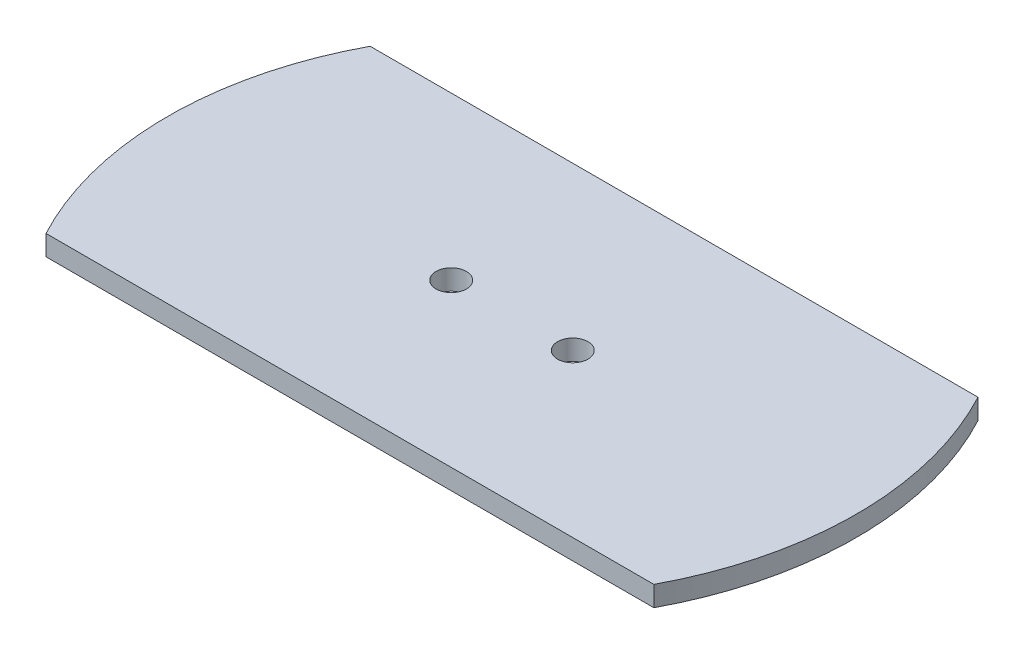
ISO-10303-21;
HEADER;
FILE_DESCRIPTION(('STEP AP214'),'2;1');
FILE_NAME('part.step','',(''),(''),'','','');
FILE_SCHEMA(('AUTOMOTIVE_DESIGN { 1 0 10303 214 1 1 1 1 }'));
ENDSEC;
DATA;
#1=APPLICATION_CONTEXT('core data for automotive mechanical design processes');
#2=APPLICATION_PROTOCOL_DEFINITION('international standard','automotive_design',2000,#1);
#3=PRODUCT_CONTEXT('',#1,'mechanical');
#4=PRODUCT('Part','Part','',(#3));
#5=PRODUCT_RELATED_PRODUCT_CATEGORY('part','',(#4));
#6=PRODUCT_DEFINITION_FORMATION('','',#4);
#7=PRODUCT_DEFINITION_CONTEXT('part definition',#1,'design');
#8=PRODUCT_DEFINITION('design','',#6,#7);
#9=PRODUCT_DEFINITION_SHAPE('','',#8);
#10=(LENGTH_UNIT() NAMED_UNIT(*) SI_UNIT(.MILLI.,.METRE.));
#11=(NAMED_UNIT(*) PLANE_ANGLE_UNIT() SI_UNIT($,.RADIAN.));
#12=(NAMED_UNIT(*) SI_UNIT($,.STERADIAN.) SOLID_ANGLE_UNIT());
#13=UNCERTAINTY_MEASURE_WITH_UNIT(LENGTH_MEASURE(1.E-05),#10,'distance_accuracy_value','');
#14=(GEOMETRIC_REPRESENTATION_CONTEXT(3) GLOBAL_UNCERTAINTY_ASSIGNED_CONTEXT((#13)) GLOBAL_UNIT_ASSIGNED_CONTEXT((#10,
#11,#12)) REPRESENTATION_CONTEXT('',''));
#15=CARTESIAN_POINT('',(0.,0.,0.));
#16=DIRECTION('',(0.,0.,1.));
#17=DIRECTION('',(1.,0.,0.));
#18=AXIS2_PLACEMENT_3D('',#15,#16,#17);
#19=CARTESIAN_POINT('',(47.625,3.175,25.4));
#20=DIRECTION('',(0.,-1.,0.));
#21=DIRECTION('',(0.,0.,-1.));
#22=AXIS2_PLACEMENT_3D('',#19,#20,#21);
#23=CYLINDRICAL_SURFACE('',#22,53.975);
#24=CARTESIAN_POINT('',(47.625,0.,25.4));
#25=DIRECTION('',(0.,1.,0.));
#26=DIRECTION('',(0.,0.,1.));
#27=AXIS2_PLACEMENT_3D('',#24,#25,#26);
#28=CIRCLE('',#27,53.975);
#29=CARTESIAN_POINT('',(0.,0.,0.));
#30=VERTEX_POINT('',#29);
#31=CARTESIAN_POINT('',(0.,0.,50.8));
#32=VERTEX_POINT('',#31);
#33=EDGE_CURVE('E101',#30,#32,#28,.T.);
#34=ORIENTED_EDGE('',*,*,#33,.T.);
#35=DIRECTION('',(0.,-1.,0.));
#36=VECTOR('',#35,1.);
#37=CARTESIAN_POINT('',(0.,3.175,50.8));
#38=LINE('',#37,#36);
#39=CARTESIAN_POINT('',(0.,3.175,50.8));
#40=VERTEX_POINT('',#39);
#41=EDGE_CURVE('E11',#40,#32,#38,.T.);
#42=ORIENTED_EDGE('',*,*,#41,.F.);
#43=CARTESIAN_POINT('',(47.625,3.175,25.4));
#44=DIRECTION('',(0.,1.,0.));
#45=DIRECTION('',(0.,0.,1.));
#46=AXIS2_PLACEMENT_3D('',#43,#44,#45);
#47=CIRCLE('',#46,53.975);
#48=CARTESIAN_POINT('',(0.,3.175,0.));
#49=VERTEX_POINT('',#48);
#50=EDGE_CURVE('E89',#49,#40,#47,.T.);
#51=ORIENTED_EDGE('',*,*,#50,.F.);
#52=DIRECTION('',(0.,-1.,0.));
#53=VECTOR('',#52,1.);
#54=CARTESIAN_POINT('',(0.,3.175,0.));
#55=LINE('',#54,#53);
#56=EDGE_CURVE('E97',#49,#30,#55,.T.);
#57=ORIENTED_EDGE('',*,*,#56,.T.);
#58=EDGE_LOOP('',(#34,#42,#51,#57));
#59=FACE_BOUND('',#58,.T.);
#60=ADVANCED_FACE('F38',(#59),#23,.T.);
#61=CARTESIAN_POINT('',(0.,3.175,50.8));
#62=DIRECTION('',(0.,0.,-1.));
#63=DIRECTION('',(-1.,0.,0.));
#64=AXIS2_PLACEMENT_3D('',#61,#62,#63);
#65=PLANE('',#64);
#66=DIRECTION('',(1.,0.,0.));
#67=VECTOR('',#66,1.);
#68=CARTESIAN_POINT('',(0.,0.,50.8));
#69=LINE('',#68,#67);
#70=CARTESIAN_POINT('',(95.25,0.,50.8));
#71=VERTEX_POINT('',#70);
#72=EDGE_CURVE('E93',#32,#71,#69,.T.);
#73=ORIENTED_EDGE('',*,*,#72,.T.);
#74=DIRECTION('',(0.,-1.,0.));
#75=VECTOR('',#74,1.);
#76=CARTESIAN_POINT('',(95.25,3.175,50.8));
#77=LINE('',#76,#75);
#78=CARTESIAN_POINT('',(95.25,3.175,50.8));
#79=VERTEX_POINT('',#78);
#80=EDGE_CURVE('E46',#79,#71,#77,.T.);
#81=ORIENTED_EDGE('',*,*,#80,.F.);
#82=DIRECTION('',(1.,0.,0.));
#83=VECTOR('',#82,1.);
#84=CARTESIAN_POINT('',(0.,3.175,50.8));
#85=LINE('',#84,#83);
#86=EDGE_CURVE('E84',#40,#79,#85,.T.);
#87=ORIENTED_EDGE('',*,*,#86,.F.);
#88=ORIENTED_EDGE('',*,*,#41,.T.);
#89=EDGE_LOOP('',(#73,#81,#87,#88));
#90=FACE_BOUND('',#89,.T.);
#91=ADVANCED_FACE('F92',(#90),#65,.F.);
#92=CARTESIAN_POINT('',(47.6249999999999,3.175,25.4));
#93=DIRECTION('',(0.,-1.,0.));
#94=DIRECTION('',(0.,0.,-1.));
#95=AXIS2_PLACEMENT_3D('',#92,#93,#94);
#96=CYLINDRICAL_SURFACE('',#95,53.9750000000001);
#97=CARTESIAN_POINT('',(47.6249999999999,0.,25.4));
#98=DIRECTION('',(0.,1.,0.));
#99=DIRECTION('',(0.,0.,-1.));
#100=AXIS2_PLACEMENT_3D('',#97,#98,#99);
#101=CIRCLE('',#100,53.9750000000001);
#102=CARTESIAN_POINT('',(95.25,0.,0.));
#103=VERTEX_POINT('',#102);
#104=EDGE_CURVE('E71',#71,#103,#101,.T.);
#105=ORIENTED_EDGE('',*,*,#104,.T.);
#106=DIRECTION('',(0.,-1.,0.));
#107=VECTOR('',#106,1.);
#108=CARTESIAN_POINT('',(95.25,3.175,0.));
#109=LINE('',#108,#107);
#110=CARTESIAN_POINT('',(95.25,3.175,0.));
#111=VERTEX_POINT('',#110);
#112=EDGE_CURVE('E94',#111,#103,#109,.T.);
#113=ORIENTED_EDGE('',*,*,#112,.F.);
#114=CARTESIAN_POINT('',(47.6249999999999,3.175,25.4));
#115=DIRECTION('',(0.,1.,0.));
#116=DIRECTION('',(0.,0.,-1.));
#117=AXIS2_PLACEMENT_3D('',#114,#115,#116);
#118=CIRCLE('',#117,53.9750000000001);
#119=EDGE_CURVE('E87',#79,#111,#118,.T.);
#120=ORIENTED_EDGE('',*,*,#119,.F.);
#121=ORIENTED_EDGE('',*,*,#80,.T.);
#122=EDGE_LOOP('',(#105,#113,#120,#121));
#123=FACE_BOUND('',#122,.T.);
#124=ADVANCED_FACE('F95',(#123),#96,.T.);
#125=CARTESIAN_POINT('',(0.,3.175,0.));
#126=DIRECTION('',(0.,0.,1.));
#127=DIRECTION('',(1.,0.,0.));
#128=AXIS2_PLACEMENT_3D('',#125,#126,#127);
#129=PLANE('',#128);
#130=DIRECTION('',(-1.,0.,0.));
#131=VECTOR('',#130,1.);
#132=CARTESIAN_POINT('',(0.,0.,0.));
#133=LINE('',#132,#131);
#134=EDGE_CURVE('E77',#103,#30,#133,.T.);
#135=ORIENTED_EDGE('',*,*,#134,.T.);
#136=ORIENTED_EDGE('',*,*,#56,.F.);
#137=DIRECTION('',(-1.,0.,0.));
#138=VECTOR('',#137,1.);
#139=CARTESIAN_POINT('',(0.,3.175,0.));
#140=LINE('',#139,#138);
#141=EDGE_CURVE('E54',#111,#49,#140,.T.);
#142=ORIENTED_EDGE('',*,*,#141,.F.);
#143=ORIENTED_EDGE('',*,*,#112,.T.);
#144=EDGE_LOOP('',(#135,#136,#142,#143));
#145=FACE_BOUND('',#144,.T.);
#146=ADVANCED_FACE('F109',(#145),#129,.F.);
#147=CARTESIAN_POINT('',(47.625,3.175,25.4));
#148=DIRECTION('',(0.,1.,0.));
#149=DIRECTION('',(0.,0.,1.));
#150=AXIS2_PLACEMENT_3D('',#147,#148,#149);
#151=PLANE('',#150);
#152=CARTESIAN_POINT('',(38.1,3.175,25.4));
#153=DIRECTION('',(0.,1.,0.));
#154=DIRECTION('',(0.,0.,1.));
#155=AXIS2_PLACEMENT_3D('',#152,#153,#154);
#156=CIRCLE('',#155,2.38125);
#157=CARTESIAN_POINT('',(38.1,3.175,27.78125));
#158=VERTEX_POINT('',#157);
#159=EDGE_CURVE('E121',#158,#158,#156,.T.);
#160=ORIENTED_EDGE('',*,*,#159,.F.);
#161=EDGE_LOOP('',(#160));
#162=FACE_BOUND('',#161,.T.);
#163=CARTESIAN_POINT('',(57.15,3.175,25.4));
#164=DIRECTION('',(0.,1.,0.));
#165=DIRECTION('',(0.,0.,1.));
#166=AXIS2_PLACEMENT_3D('',#163,#164,#165);
#167=CIRCLE('',#166,2.38125);
#168=CARTESIAN_POINT('',(57.15,3.175,27.78125));
#169=VERTEX_POINT('',#168);
#170=EDGE_CURVE('E115',#169,#169,#167,.T.);
#171=ORIENTED_EDGE('',*,*,#170,.F.);
#172=EDGE_LOOP('',(#171));
#173=FACE_BOUND('',#172,.T.);
#174=ORIENTED_EDGE('',*,*,#50,.T.);
#175=ORIENTED_EDGE('',*,*,#86,.T.);
#176=ORIENTED_EDGE('',*,*,#119,.T.);
#177=ORIENTED_EDGE('',*,*,#141,.T.);
#178=EDGE_LOOP('',(#174,#175,#176,#177));
#179=FACE_BOUND('',#178,.T.);
#180=ADVANCED_FACE('F85',(#162,#173,#179),#151,.T.);
#181=CARTESIAN_POINT('',(47.625,0.,25.4));
#182=DIRECTION('',(0.,1.,0.));
#183=DIRECTION('',(0.,0.,1.));
#184=AXIS2_PLACEMENT_3D('',#181,#182,#183);
#185=PLANE('',#184);
#186=CARTESIAN_POINT('',(38.1,0.,25.4));
#187=DIRECTION('',(0.,1.,0.));
#188=DIRECTION('',(0.,0.,1.));
#189=AXIS2_PLACEMENT_3D('',#186,#187,#188);
#190=CIRCLE('',#189,2.38125);
#191=CARTESIAN_POINT('',(38.1,0.,27.78125));
#192=VERTEX_POINT('',#191);
#193=EDGE_CURVE('E104',#192,#192,#190,.T.);
#194=ORIENTED_EDGE('',*,*,#193,.T.);
#195=EDGE_LOOP('',(#194));
#196=FACE_BOUND('',#195,.T.);
#197=CARTESIAN_POINT('',(57.15,0.,25.4));
#198=DIRECTION('',(0.,1.,0.));
#199=DIRECTION('',(0.,0.,1.));
#200=AXIS2_PLACEMENT_3D('',#197,#198,#199);
#201=CIRCLE('',#200,2.38125);
#202=CARTESIAN_POINT('',(57.15,0.,27.78125));
#203=VERTEX_POINT('',#202);
#204=EDGE_CURVE('E118',#203,#203,#201,.T.);
#205=ORIENTED_EDGE('',*,*,#204,.T.);
#206=EDGE_LOOP('',(#205));
#207=FACE_BOUND('',#206,.T.);
#208=ORIENTED_EDGE('',*,*,#33,.F.);
#209=ORIENTED_EDGE('',*,*,#134,.F.);
#210=ORIENTED_EDGE('',*,*,#104,.F.);
#211=ORIENTED_EDGE('',*,*,#72,.F.);
#212=EDGE_LOOP('',(#208,#209,#210,#211));
#213=FACE_BOUND('',#212,.T.);
#214=ADVANCED_FACE('F112',(#196,#207,#213),#185,.F.);
#215=CARTESIAN_POINT('',(57.15,0.,25.4));
#216=DIRECTION('',(0.,1.,0.));
#217=DIRECTION('',(0.,0.,1.));
#218=AXIS2_PLACEMENT_3D('',#215,#216,#217);
#219=CYLINDRICAL_SURFACE('',#218,2.38125);
#220=ORIENTED_EDGE('',*,*,#204,.F.);
#221=EDGE_LOOP('',(#220));
#222=FACE_BOUND('',#221,.T.);
#223=ORIENTED_EDGE('',*,*,#170,.T.);
#224=EDGE_LOOP('',(#223));
#225=FACE_BOUND('',#224,.T.);
#226=ADVANCED_FACE('F132',(#222,#225),#219,.F.);
#227=CARTESIAN_POINT('',(38.1,0.,25.4));
#228=DIRECTION('',(0.,1.,0.));
#229=DIRECTION('',(0.,0.,1.));
#230=AXIS2_PLACEMENT_3D('',#227,#228,#229);
#231=CYLINDRICAL_SURFACE('',#230,2.38125);
#232=ORIENTED_EDGE('',*,*,#193,.F.);
#233=EDGE_LOOP('',(#232));
#234=FACE_BOUND('',#233,.T.);
#235=ORIENTED_EDGE('',*,*,#159,.T.);
#236=EDGE_LOOP('',(#235));
#237=FACE_BOUND('',#236,.T.);
#238=ADVANCED_FACE('F129',(#234,#237),#231,.F.);
#239=CLOSED_SHELL('',(#60,#91,#124,#146,#180,#214,#226,#238));
#240=MANIFOLD_SOLID_BREP('B2',#239);
#241=ADVANCED_BREP_SHAPE_REPRESENTATION('',(#18,#240),#14);
#242=SHAPE_DEFINITION_REPRESENTATION(#9,#241);
ENDSEC;
END-ISO-10303-21;
